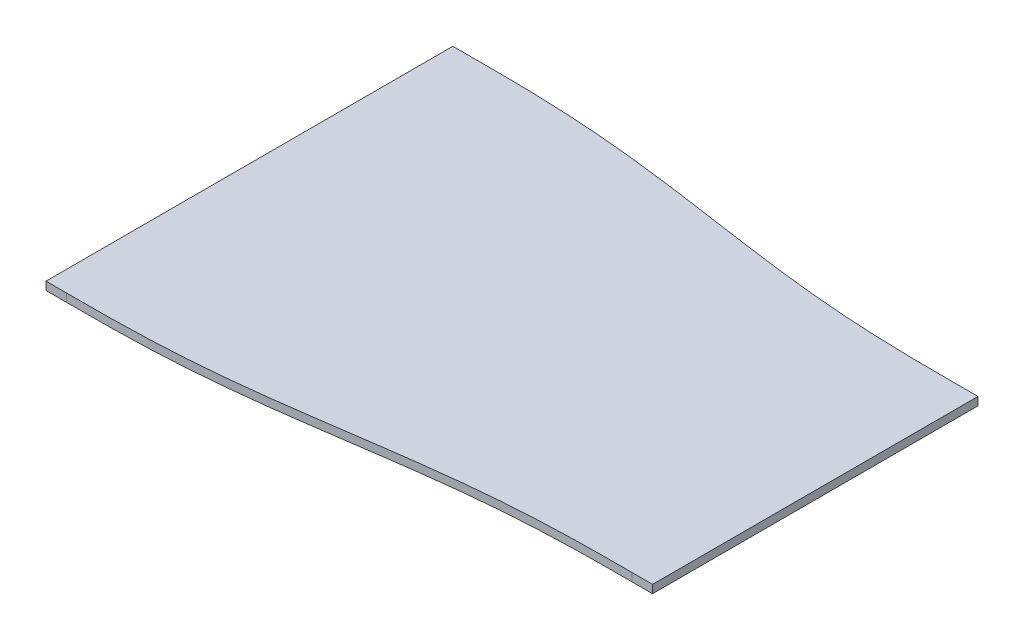
ISO-10303-21;
HEADER;
FILE_DESCRIPTION(('STEP AP214'),'2;1');
FILE_NAME('part.step','',(''),(''),'','','');
FILE_SCHEMA(('AUTOMOTIVE_DESIGN { 1 0 10303 214 1 1 1 1 }'));
ENDSEC;
DATA;
#1=APPLICATION_CONTEXT('core data for automotive mechanical design processes');
#2=APPLICATION_PROTOCOL_DEFINITION('international standard','automotive_design',2000,#1);
#3=PRODUCT_CONTEXT('',#1,'mechanical');
#4=PRODUCT('Part','Part','',(#3));
#5=PRODUCT_RELATED_PRODUCT_CATEGORY('part','',(#4));
#6=PRODUCT_DEFINITION_FORMATION('','',#4);
#7=PRODUCT_DEFINITION_CONTEXT('part definition',#1,'design');
#8=PRODUCT_DEFINITION('design','',#6,#7);
#9=PRODUCT_DEFINITION_SHAPE('','',#8);
#10=(LENGTH_UNIT() NAMED_UNIT(*) SI_UNIT(.MILLI.,.METRE.));
#11=(NAMED_UNIT(*) PLANE_ANGLE_UNIT() SI_UNIT($,.RADIAN.));
#12=(NAMED_UNIT(*) SI_UNIT($,.STERADIAN.) SOLID_ANGLE_UNIT());
#13=UNCERTAINTY_MEASURE_WITH_UNIT(LENGTH_MEASURE(1.E-05),#10,'distance_accuracy_value','');
#14=(GEOMETRIC_REPRESENTATION_CONTEXT(3) GLOBAL_UNCERTAINTY_ASSIGNED_CONTEXT((#13)) GLOBAL_UNIT_ASSIGNED_CONTEXT((#10,
#11,#12)) REPRESENTATION_CONTEXT('',''));
#15=CARTESIAN_POINT('',(0.,0.,0.));
#16=DIRECTION('',(0.,0.,1.));
#17=DIRECTION('',(1.,0.,0.));
#18=AXIS2_PLACEMENT_3D('',#15,#16,#17);
#19=CARTESIAN_POINT('',(670.050000000231,10.,199.999999999994));
#20=DIRECTION('',(-1.,0.,0.));
#21=DIRECTION('',(0.,0.,1.));
#22=AXIS2_PLACEMENT_3D('',#19,#20,#21);
#23=PLANE('',#22);
#24=DIRECTION('',(0.,0.,-1.));
#25=VECTOR('',#24,1.);
#26=CARTESIAN_POINT('',(670.050000000231,0.,199.999999999994));
#27=LINE('',#26,#25);
#28=CARTESIAN_POINT('',(670.050000000231,0.,199.999999999994));
#29=VERTEX_POINT('',#28);
#30=CARTESIAN_POINT('',(670.050000000231,0.,-199.999999999602));
#31=VERTEX_POINT('',#30);
#32=EDGE_CURVE('E192',#29,#31,#27,.T.);
#33=ORIENTED_EDGE('',*,*,#32,.T.);
#34=DIRECTION('',(0.,-1.,0.));
#35=VECTOR('',#34,1.);
#36=CARTESIAN_POINT('',(670.050000000231,10.,-199.999999999602));
#37=LINE('',#36,#35);
#38=CARTESIAN_POINT('',(670.050000000231,10.,-199.999999999602));
#39=VERTEX_POINT('',#38);
#40=EDGE_CURVE('E11',#39,#31,#37,.T.);
#41=ORIENTED_EDGE('',*,*,#40,.F.);
#42=DIRECTION('',(0.,0.,-1.));
#43=VECTOR('',#42,1.);
#44=CARTESIAN_POINT('',(670.050000000231,10.,199.999999999994));
#45=LINE('',#44,#43);
#46=CARTESIAN_POINT('',(670.050000000231,10.,199.999999999994));
#47=VERTEX_POINT('',#46);
#48=EDGE_CURVE('E209',#47,#39,#45,.T.);
#49=ORIENTED_EDGE('',*,*,#48,.F.);
#50=DIRECTION('',(0.,-1.,0.));
#51=VECTOR('',#50,1.);
#52=CARTESIAN_POINT('',(670.050000000231,10.,199.999999999994));
#53=LINE('',#52,#51);
#54=EDGE_CURVE('E125',#47,#29,#53,.T.);
#55=ORIENTED_EDGE('',*,*,#54,.T.);
#56=EDGE_LOOP('',(#33,#41,#49,#55));
#57=FACE_BOUND('',#56,.T.);
#58=ADVANCED_FACE('F33',(#57),#23,.F.);
#59=CARTESIAN_POINT('',(644.650000000231,10.,-199.999999999602));
#60=DIRECTION('',(0.,0.,1.));
#61=DIRECTION('',(1.,0.,0.));
#62=AXIS2_PLACEMENT_3D('',#59,#60,#61);
#63=PLANE('',#62);
#64=DIRECTION('',(-1.,0.,0.));
#65=VECTOR('',#64,1.);
#66=CARTESIAN_POINT('',(644.650000000231,0.,-199.999999999602));
#67=LINE('',#66,#65);
#68=CARTESIAN_POINT('',(644.650000000231,0.,-199.999999999602));
#69=VERTEX_POINT('',#68);
#70=EDGE_CURVE('E189',#31,#69,#67,.T.);
#71=ORIENTED_EDGE('',*,*,#70,.T.);
#72=DIRECTION('',(0.,-1.,0.));
#73=VECTOR('',#72,1.);
#74=CARTESIAN_POINT('',(644.650000000231,10.,-199.999999999602));
#75=LINE('',#74,#73);
#76=CARTESIAN_POINT('',(644.650000000231,10.,-199.999999999602));
#77=VERTEX_POINT('',#76);
#78=EDGE_CURVE('E41',#77,#69,#75,.T.);
#79=ORIENTED_EDGE('',*,*,#78,.F.);
#80=DIRECTION('',(-1.,0.,0.));
#81=VECTOR('',#80,1.);
#82=CARTESIAN_POINT('',(644.650000000231,10.,-199.999999999602));
#83=LINE('',#82,#81);
#84=EDGE_CURVE('E92',#39,#77,#83,.T.);
#85=ORIENTED_EDGE('',*,*,#84,.F.);
#86=ORIENTED_EDGE('',*,*,#40,.T.);
#87=EDGE_LOOP('',(#71,#79,#85,#86));
#88=FACE_BOUND('',#87,.T.);
#89=ADVANCED_FACE('F154',(#88),#63,.F.);
#90=CARTESIAN_POINT('',(644.650000000236,10.,-199.999999999603));
#91=CARTESIAN_POINT('',(642.128887323101,10.,-199.999999999604));
#92=CARTESIAN_POINT('',(638.382457018866,10.,-199.999999984757));
#93=CARTESIAN_POINT('',(629.712769059734,10.,-200.002474738857));
#94=CARTESIAN_POINT('',(624.206757774097,10.,-200.015195132757));
#95=CARTESIAN_POINT('',(616.977186652625,10.,-200.033217285951));
#96=CARTESIAN_POINT('',(611.673694071765,10.,-200.061023788659));
#97=CARTESIAN_POINT('',(605.189888029535,10.,-200.100425069511));
#98=CARTESIAN_POINT('',(599.293422889466,10.,-200.153904026494));
#99=CARTESIAN_POINT('',(592.950274347342,10.,-200.223777791852));
#100=CARTESIAN_POINT('',(585.077126140812,10.,-200.334920276666));
#101=CARTESIAN_POINT('',(575.615150605977,10.,-200.506371684541));
#102=CARTESIAN_POINT('',(564.778145102134,10.,-200.764489072655));
#103=CARTESIAN_POINT('',(549.478620254523,10.,-201.239741284618));
#104=CARTESIAN_POINT('',(531.359153773348,10.,-201.987923337076));
#105=CARTESIAN_POINT('',(510.224122789078,10.,-203.148964487618));
#106=CARTESIAN_POINT('',(489.117075125837,10.,-204.664961439601));
#107=CARTESIAN_POINT('',(471.042219016799,10.,-206.211322516499));
#108=CARTESIAN_POINT('',(452.986247287745,10.,-207.94458891218));
#109=CARTESIAN_POINT('',(433.001107321674,10.,-210.061958697482));
#110=CARTESIAN_POINT('',(410.042516088179,10.,-212.789005998156));
#111=CARTESIAN_POINT('',(384.120515653695,10.,-216.183750570737));
#112=CARTESIAN_POINT('',(358.228844737021,10.,-219.797816742544));
#113=CARTESIAN_POINT('',(334.291027151638,10.,-223.253392129152));
#114=CARTESIAN_POINT('',(310.358989888133,10.,-226.746607493557));
#115=CARTESIAN_POINT('',(286.421101663587,10.,-230.202184450567));
#116=CARTESIAN_POINT('',(260.529589306638,10.,-233.816247037121));
#117=CARTESIAN_POINT('',(234.607319328917,10.,-237.210998028756));
#118=CARTESIAN_POINT('',(208.646910268751,10.,-240.294638585617));
#119=CARTESIAN_POINT('',(182.641737439012,10.,-242.990791615495));
#120=CARTESIAN_POINT('',(158.550277549518,10.,-245.118473578478));
#121=CARTESIAN_POINT('',(134.422777808158,10.,-246.851031881093));
#122=CARTESIAN_POINT('',(110.27707794291,10.,-248.177942168241));
#123=CARTESIAN_POINT('',(88.9383800885653,10.,-249.000224322157));
#124=CARTESIAN_POINT('',(72.0553878654647,10.,-249.438693030905));
#125=CARTESIAN_POINT('',(59.5777987769528,10.,-249.665078924938));
#126=CARTESIAN_POINT('',(51.6977397383509,10.,-249.776222765111));
#127=CARTESIAN_POINT('',(45.353978297629,10.,-249.846095556507));
#128=CARTESIAN_POINT('',(39.4690194837837,10.,-249.899575195096));
#129=CARTESIAN_POINT('',(32.9584093593179,10.,-249.938976051475));
#130=CARTESIAN_POINT('',(27.7035624300112,10.,-249.966782803266));
#131=CARTESIAN_POINT('',(20.3962778483213,10.,-249.984804823661));
#132=CARTESIAN_POINT('',(15.0165072907433,10.,-249.997525286364));
#133=CARTESIAN_POINT('',(6.20960090593619,10.,-250.000000012963));
#134=CARTESIAN_POINT('',(2.52111267707503,10.,-249.999999999998));
#135=CARTESIAN_POINT('',(-1.4576344786805E-10,10.,-250.));
#136=B_SPLINE_CURVE_WITH_KNOTS('',4,(#90,#91,#92,#93,#94,#95,#96,#97,#98,#99,#100,#101,#102,
#103,#104,#105,#106,#107,#108,#109,#110,#111,#112,#113,#114,#115,#116,#117,#118,#119,#120,#121,
#122,#123,#124,#125,#126,#127,#128,#129,#130,#131,#132,#133,#134,#135),.UNSPECIFIED.,.F.,.F.,(5,
1,1,1,1,1,1,1,1,1,1,1,1,1,1,1,1,1,1,1,1,1,1,1,1,1,1,1,1,1,1,1,1,1,1,1,1,1,1,1,1,1,5),
(0.0830423094644617,0.0986189314826091,0.106407242491683,0.114195553500756,0.12198386450983,
0.129772175518904,0.137560486527977,0.145348797537051,0.153607863121786,0.16186692870652,
0.17838505987599,0.193961681412317,0.209538302948644,0.240691545530784,0.271844787408312,
0.302998032082512,0.318574655477985,0.334151278873459,0.365304526363944,0.406540267070604,
0.437693511258934,0.468846755447264,0.499999999999994,0.531153244552725,0.562306488741055,
0.593459732929385,0.634695473636054,0.665848721126538,0.697001967917485,0.728155212591684,
0.759308454469212,0.790461697051351,0.821614940124003,0.838133071293466,0.846392136878198,
0.854651202462929,0.862439513472005,0.870227824481081,0.878016135490157,0.885804446499232,
0.893592757508308,0.901381068517384,0.916957690535536),.UNSPECIFIED.);
#137=DIRECTION('',(0.,-1.,0.));
#138=VECTOR('',#137,1.);
#139=SURFACE_OF_LINEAR_EXTRUSION('',#136,#138);
#140=CARTESIAN_POINT('',(644.650000000236,0.,-199.999999999603));
#141=CARTESIAN_POINT('',(642.128887323101,0.,-199.999999999604));
#142=CARTESIAN_POINT('',(638.382457018866,0.,-199.999999984757));
#143=CARTESIAN_POINT('',(629.712769059734,0.,-200.002474738857));
#144=CARTESIAN_POINT('',(624.206757774097,0.,-200.015195132757));
#145=CARTESIAN_POINT('',(616.977186652625,0.,-200.033217285951));
#146=CARTESIAN_POINT('',(611.673694071765,0.,-200.061023788659));
#147=CARTESIAN_POINT('',(605.189888029535,0.,-200.100425069511));
#148=CARTESIAN_POINT('',(599.293422889466,0.,-200.153904026494));
#149=CARTESIAN_POINT('',(592.950274347342,0.,-200.223777791852));
#150=CARTESIAN_POINT('',(585.077126140812,0.,-200.334920276666));
#151=CARTESIAN_POINT('',(575.615150605977,0.,-200.506371684541));
#152=CARTESIAN_POINT('',(564.778145102134,0.,-200.764489072655));
#153=CARTESIAN_POINT('',(549.478620254523,0.,-201.239741284618));
#154=CARTESIAN_POINT('',(531.359153773348,0.,-201.987923337076));
#155=CARTESIAN_POINT('',(510.224122789078,0.,-203.148964487618));
#156=CARTESIAN_POINT('',(489.117075125837,0.,-204.664961439601));
#157=CARTESIAN_POINT('',(471.042219016799,0.,-206.211322516499));
#158=CARTESIAN_POINT('',(452.986247287745,0.,-207.94458891218));
#159=CARTESIAN_POINT('',(433.001107321674,0.,-210.061958697482));
#160=CARTESIAN_POINT('',(410.042516088179,0.,-212.789005998156));
#161=CARTESIAN_POINT('',(384.120515653695,0.,-216.183750570737));
#162=CARTESIAN_POINT('',(358.228844737021,0.,-219.797816742544));
#163=CARTESIAN_POINT('',(334.291027151638,0.,-223.253392129152));
#164=CARTESIAN_POINT('',(310.358989888133,0.,-226.746607493557));
#165=CARTESIAN_POINT('',(286.421101663587,0.,-230.202184450567));
#166=CARTESIAN_POINT('',(260.529589306638,0.,-233.816247037121));
#167=CARTESIAN_POINT('',(234.607319328917,0.,-237.210998028756));
#168=CARTESIAN_POINT('',(208.646910268751,0.,-240.294638585617));
#169=CARTESIAN_POINT('',(182.641737439012,0.,-242.990791615495));
#170=CARTESIAN_POINT('',(158.550277549518,0.,-245.118473578478));
#171=CARTESIAN_POINT('',(134.422777808158,0.,-246.851031881093));
#172=CARTESIAN_POINT('',(110.27707794291,0.,-248.177942168241));
#173=CARTESIAN_POINT('',(88.9383800885653,0.,-249.000224322157));
#174=CARTESIAN_POINT('',(72.0553878654647,0.,-249.438693030905));
#175=CARTESIAN_POINT('',(59.5777987769528,0.,-249.665078924938));
#176=CARTESIAN_POINT('',(51.6977397383509,0.,-249.776222765111));
#177=CARTESIAN_POINT('',(45.353978297629,0.,-249.846095556507));
#178=CARTESIAN_POINT('',(39.4690194837837,0.,-249.899575195096));
#179=CARTESIAN_POINT('',(32.9584093593179,0.,-249.938976051475));
#180=CARTESIAN_POINT('',(27.7035624300112,0.,-249.966782803266));
#181=CARTESIAN_POINT('',(20.3962778483213,0.,-249.984804823661));
#182=CARTESIAN_POINT('',(15.0165072907433,0.,-249.997525286364));
#183=CARTESIAN_POINT('',(6.20960090593619,0.,-250.000000012963));
#184=CARTESIAN_POINT('',(2.52111267707503,0.,-249.999999999998));
#185=CARTESIAN_POINT('',(-1.4576344786805E-10,0.,-250.));
#186=B_SPLINE_CURVE_WITH_KNOTS('',4,(#140,#141,#142,#143,#144,#145,#146,#147,#148,#149,#150,
#151,#152,#153,#154,#155,#156,#157,#158,#159,#160,#161,#162,#163,#164,#165,#166,#167,#168,#169,
#170,#171,#172,#173,#174,#175,#176,#177,#178,#179,#180,#181,#182,#183,#184,#185),.UNSPECIFIED.,
.F.,.F.,(5,1,1,1,1,1,1,1,1,1,1,1,1,1,1,1,1,1,1,1,1,1,1,1,1,1,1,1,1,1,1,1,1,1,1,1,1,1,1,1,1,1,5),
(0.0830423094644617,0.0986189314826091,0.106407242491683,0.114195553500756,0.12198386450983,
0.129772175518904,0.137560486527977,0.145348797537051,0.153607863121786,0.16186692870652,
0.17838505987599,0.193961681412317,0.209538302948644,0.240691545530784,0.271844787408312,
0.302998032082512,0.318574655477985,0.334151278873459,0.365304526363944,0.406540267070604,
0.437693511258934,0.468846755447264,0.499999999999994,0.531153244552725,0.562306488741055,
0.593459732929385,0.634695473636054,0.665848721126538,0.697001967917485,0.728155212591684,
0.759308454469212,0.790461697051351,0.821614940124003,0.838133071293466,0.846392136878198,
0.854651202462929,0.862439513472005,0.870227824481081,0.878016135490157,0.885804446499232,
0.893592757508308,0.901381068517384,0.916957690535536),.UNSPECIFIED.);
#187=CARTESIAN_POINT('',(-1.4576344786805E-10,0.,-250.));
#188=VERTEX_POINT('',#187);
#189=EDGE_CURVE('E185',#69,#188,#186,.T.);
#190=ORIENTED_EDGE('',*,*,#189,.T.);
#191=DIRECTION('',(0.,-1.,0.));
#192=VECTOR('',#191,1.);
#193=CARTESIAN_POINT('',(-1.4576344786805E-10,10.,-250.));
#194=LINE('',#193,#192);
#195=CARTESIAN_POINT('',(-1.4576344786805E-10,10.,-250.));
#196=VERTEX_POINT('',#195);
#197=EDGE_CURVE('E177',#196,#188,#194,.T.);
#198=ORIENTED_EDGE('',*,*,#197,.F.);
#199=EDGE_CURVE('E156',#77,#196,#136,.T.);
#200=ORIENTED_EDGE('',*,*,#199,.F.);
#201=ORIENTED_EDGE('',*,*,#78,.T.);
#202=EDGE_LOOP('',(#190,#198,#200,#201));
#203=FACE_BOUND('',#202,.T.);
#204=ADVANCED_FACE('F150',(#203),#139,.F.);
#205=CARTESIAN_POINT('',(-1.21469783016803E-10,10.,-250.));
#206=DIRECTION('',(0.,0.,1.));
#207=DIRECTION('',(1.,0.,0.));
#208=AXIS2_PLACEMENT_3D('',#205,#206,#207);
#209=PLANE('',#208);
#210=DIRECTION('',(-1.,0.,0.));
#211=VECTOR('',#210,1.);
#212=CARTESIAN_POINT('',(-1.21469783016803E-10,0.,-250.));
#213=LINE('',#212,#211);
#214=CARTESIAN_POINT('',(-25.4000000001215,0.,-250.));
#215=VERTEX_POINT('',#214);
#216=EDGE_CURVE('E175',#188,#215,#213,.T.);
#217=ORIENTED_EDGE('',*,*,#216,.T.);
#218=DIRECTION('',(0.,-1.,0.));
#219=VECTOR('',#218,1.);
#220=CARTESIAN_POINT('',(-25.4000000001215,10.,-250.));
#221=LINE('',#220,#219);
#222=CARTESIAN_POINT('',(-25.4000000001215,10.,-250.));
#223=VERTEX_POINT('',#222);
#224=EDGE_CURVE('E173',#223,#215,#221,.T.);
#225=ORIENTED_EDGE('',*,*,#224,.F.);
#226=DIRECTION('',(-1.,0.,0.));
#227=VECTOR('',#226,1.);
#228=CARTESIAN_POINT('',(-1.21469783016803E-10,10.,-250.));
#229=LINE('',#228,#227);
#230=EDGE_CURVE('E162',#196,#223,#229,.T.);
#231=ORIENTED_EDGE('',*,*,#230,.F.);
#232=ORIENTED_EDGE('',*,*,#197,.T.);
#233=EDGE_LOOP('',(#217,#225,#231,#232));
#234=FACE_BOUND('',#233,.T.);
#235=ADVANCED_FACE('F146',(#234),#209,.F.);
#236=CARTESIAN_POINT('',(-25.4000000001215,10.,250.));
#237=DIRECTION('',(1.,0.,0.));
#238=DIRECTION('',(0.,0.,-1.));
#239=AXIS2_PLACEMENT_3D('',#236,#237,#238);
#240=PLANE('',#239);
#241=DIRECTION('',(0.,0.,1.));
#242=VECTOR('',#241,1.);
#243=CARTESIAN_POINT('',(-25.4000000001215,0.,250.));
#244=LINE('',#243,#242);
#245=CARTESIAN_POINT('',(-25.4000000001215,0.,250.));
#246=VERTEX_POINT('',#245);
#247=EDGE_CURVE('E179',#215,#246,#244,.T.);
#248=ORIENTED_EDGE('',*,*,#247,.T.);
#249=DIRECTION('',(0.,-1.,0.));
#250=VECTOR('',#249,1.);
#251=CARTESIAN_POINT('',(-25.4000000001215,10.,250.));
#252=LINE('',#251,#250);
#253=CARTESIAN_POINT('',(-25.4000000001215,10.,250.));
#254=VERTEX_POINT('',#253);
#255=EDGE_CURVE('E120',#254,#246,#252,.T.);
#256=ORIENTED_EDGE('',*,*,#255,.F.);
#257=DIRECTION('',(0.,0.,1.));
#258=VECTOR('',#257,1.);
#259=CARTESIAN_POINT('',(-25.4000000001215,10.,250.));
#260=LINE('',#259,#258);
#261=EDGE_CURVE('E111',#223,#254,#260,.T.);
#262=ORIENTED_EDGE('',*,*,#261,.F.);
#263=ORIENTED_EDGE('',*,*,#224,.T.);
#264=EDGE_LOOP('',(#248,#256,#262,#263));
#265=FACE_BOUND('',#264,.T.);
#266=ADVANCED_FACE('F143',(#265),#240,.F.);
#267=CARTESIAN_POINT('',(-1.21471626160496E-10,10.,250.));
#268=DIRECTION('',(0.,0.,-1.));
#269=DIRECTION('',(-1.,0.,0.));
#270=AXIS2_PLACEMENT_3D('',#267,#268,#269);
#271=PLANE('',#270);
#272=DIRECTION('',(1.,0.,0.));
#273=VECTOR('',#272,1.);
#274=CARTESIAN_POINT('',(-1.21471626160496E-10,0.,250.));
#275=LINE('',#274,#273);
#276=CARTESIAN_POINT('',(-1.21471626160496E-10,0.,250.));
#277=VERTEX_POINT('',#276);
#278=EDGE_CURVE('E119',#246,#277,#275,.T.);
#279=ORIENTED_EDGE('',*,*,#278,.T.);
#280=DIRECTION('',(0.,-1.,0.));
#281=VECTOR('',#280,1.);
#282=CARTESIAN_POINT('',(-1.21471626160496E-10,10.,250.));
#283=LINE('',#282,#281);
#284=CARTESIAN_POINT('',(-1.21471626160496E-10,10.,250.));
#285=VERTEX_POINT('',#284);
#286=EDGE_CURVE('E116',#285,#277,#283,.T.);
#287=ORIENTED_EDGE('',*,*,#286,.F.);
#288=DIRECTION('',(1.,0.,0.));
#289=VECTOR('',#288,1.);
#290=CARTESIAN_POINT('',(-1.21471626160496E-10,10.,250.));
#291=LINE('',#290,#289);
#292=EDGE_CURVE('E105',#254,#285,#291,.T.);
#293=ORIENTED_EDGE('',*,*,#292,.F.);
#294=ORIENTED_EDGE('',*,*,#255,.T.);
#295=EDGE_LOOP('',(#279,#287,#293,#294));
#296=FACE_BOUND('',#295,.T.);
#297=ADVANCED_FACE('F117',(#296),#271,.F.);
#298=CARTESIAN_POINT('',(-1.45765545288206E-10,10.,250.));
#299=CARTESIAN_POINT('',(2.52111267706858,10.,250.));
#300=CARTESIAN_POINT('',(6.20960090593315,10.,250.000000012966));
#301=CARTESIAN_POINT('',(15.0165072907244,10.,249.997525286373));
#302=CARTESIAN_POINT('',(20.3962778482974,10.,249.984804823673));
#303=CARTESIAN_POINT('',(27.7035624299872,10.,249.966782803283));
#304=CARTESIAN_POINT('',(32.9584093592939,10.,249.938976051495));
#305=CARTESIAN_POINT('',(39.4690194837598,10.,249.89957519512));
#306=CARTESIAN_POINT('',(45.3539782976051,10.,249.846095556534));
#307=CARTESIAN_POINT('',(51.697739738327,10.,249.776222765143));
#308=CARTESIAN_POINT('',(59.577798776929,10.,249.665078924975));
#309=CARTESIAN_POINT('',(72.0553878654411,10.,249.438693030949));
#310=CARTESIAN_POINT('',(88.9383800885419,10.,249.000224322211));
#311=CARTESIAN_POINT('',(110.277077942887,10.,248.177942168308));
#312=CARTESIAN_POINT('',(134.422777808136,10.,246.851031881175));
#313=CARTESIAN_POINT('',(158.550277549497,10.,245.118473578575));
#314=CARTESIAN_POINT('',(182.641737438992,10.,242.990791615606));
#315=CARTESIAN_POINT('',(208.646910268733,10.,240.294638585744));
#316=CARTESIAN_POINT('',(234.607319328901,10.,237.210998028898));
#317=CARTESIAN_POINT('',(260.529589306624,10.,233.816247037279));
#318=CARTESIAN_POINT('',(286.421101663575,10.,230.202184450741));
#319=CARTESIAN_POINT('',(310.358989888123,10.,226.746607493746));
#320=CARTESIAN_POINT('',(334.29102715163,10.,223.253392129355));
#321=CARTESIAN_POINT('',(358.228844737015,10.,219.797816742761));
#322=CARTESIAN_POINT('',(384.120515653691,10.,216.183750570971));
#323=CARTESIAN_POINT('',(410.042516088177,10.,212.789005998405));
#324=CARTESIAN_POINT('',(433.001107321674,10.,210.061958697745));
#325=CARTESIAN_POINT('',(452.986247287747,10.,207.944588912455));
#326=CARTESIAN_POINT('',(471.042219016802,10.,206.211322516785));
#327=CARTESIAN_POINT('',(489.117075125841,10.,204.664961439898));
#328=CARTESIAN_POINT('',(510.224122789083,10.,203.148964487928));
#329=CARTESIAN_POINT('',(531.359153773354,10.,201.987923337399));
#330=CARTESIAN_POINT('',(549.478620254528,10.,201.239741284952));
#331=CARTESIAN_POINT('',(564.77814510214,10.,200.764489072998));
#332=CARTESIAN_POINT('',(575.615150605983,10.,200.50637168489));
#333=CARTESIAN_POINT('',(585.077126140818,10.,200.334920277021));
#334=CARTESIAN_POINT('',(592.950274347348,10.,200.223777792212));
#335=CARTESIAN_POINT('',(599.293422889472,10.,200.153904026858));
#336=CARTESIAN_POINT('',(605.189888029541,10.,200.100425069878));
#337=CARTESIAN_POINT('',(611.673694071772,10.,200.061023789031));
#338=CARTESIAN_POINT('',(616.977186652631,10.,200.033217286325));
#339=CARTESIAN_POINT('',(624.206757774103,10.,200.015195133136));
#340=CARTESIAN_POINT('',(629.712769059739,10.,200.00247473924));
#341=CARTESIAN_POINT('',(638.382457018867,10.,199.999999985145));
#342=CARTESIAN_POINT('',(642.128887323102,10.,199.999999999994));
#343=CARTESIAN_POINT('',(644.650000000236,10.,199.999999999994));
#344=B_SPLINE_CURVE_WITH_KNOTS('',4,(#298,#299,#300,#301,#302,#303,#304,#305,#306,#307,#308,
#309,#310,#311,#312,#313,#314,#315,#316,#317,#318,#319,#320,#321,#322,#323,#324,#325,#326,#327,
#328,#329,#330,#331,#332,#333,#334,#335,#336,#337,#338,#339,#340,#341,#342,#343),.UNSPECIFIED.,
.F.,.F.,(5,1,1,1,1,1,1,1,1,1,1,1,1,1,1,1,1,1,1,1,1,1,1,1,1,1,1,1,1,1,1,1,1,1,1,1,1,1,1,1,1,1,5),
(0.0830423094644617,0.0986189314826134,0.106407242491689,0.114195553500765,0.121983864509841,
0.129772175518917,0.137560486527993,0.145348797537068,0.1536078631218,0.161866928706532,
0.178385059875995,0.209538302948646,0.240691545530785,0.271844787408313,0.302998032082513,
0.33415127887346,0.365304526363944,0.406540267070612,0.437693511258943,0.468846755447273,
0.500000000000003,0.531153244552733,0.562306488741064,0.593459732929394,0.634695473636054,
0.665848721126538,0.681425344522012,0.697001967917486,0.728155212591686,0.759308454469214,
0.790461697051354,0.806038318587681,0.821614940124008,0.838133071293477,0.846392136878212,
0.854651202462946,0.86243951347202,0.870227824481094,0.878016135490167,0.885804446499241,
0.893592757508315,0.901381068517388,0.916957690535536),.UNSPECIFIED.);
#345=DIRECTION('',(0.,-1.,0.));
#346=VECTOR('',#345,1.);
#347=SURFACE_OF_LINEAR_EXTRUSION('',#344,#346);
#348=CARTESIAN_POINT('',(-1.45765545288206E-10,0.,250.));
#349=CARTESIAN_POINT('',(2.52111267706858,0.,250.));
#350=CARTESIAN_POINT('',(6.20960090593315,0.,250.000000012966));
#351=CARTESIAN_POINT('',(15.0165072907244,0.,249.997525286373));
#352=CARTESIAN_POINT('',(20.3962778482974,0.,249.984804823673));
#353=CARTESIAN_POINT('',(27.7035624299872,0.,249.966782803283));
#354=CARTESIAN_POINT('',(32.9584093592939,0.,249.938976051495));
#355=CARTESIAN_POINT('',(39.4690194837598,0.,249.89957519512));
#356=CARTESIAN_POINT('',(45.3539782976051,0.,249.846095556534));
#357=CARTESIAN_POINT('',(51.697739738327,0.,249.776222765143));
#358=CARTESIAN_POINT('',(59.577798776929,0.,249.665078924975));
#359=CARTESIAN_POINT('',(72.0553878654411,0.,249.438693030949));
#360=CARTESIAN_POINT('',(88.9383800885419,0.,249.000224322211));
#361=CARTESIAN_POINT('',(110.277077942887,0.,248.177942168308));
#362=CARTESIAN_POINT('',(134.422777808136,0.,246.851031881175));
#363=CARTESIAN_POINT('',(158.550277549497,0.,245.118473578575));
#364=CARTESIAN_POINT('',(182.641737438992,0.,242.990791615606));
#365=CARTESIAN_POINT('',(208.646910268733,0.,240.294638585744));
#366=CARTESIAN_POINT('',(234.607319328901,0.,237.210998028898));
#367=CARTESIAN_POINT('',(260.529589306624,0.,233.816247037279));
#368=CARTESIAN_POINT('',(286.421101663575,0.,230.202184450741));
#369=CARTESIAN_POINT('',(310.358989888123,0.,226.746607493746));
#370=CARTESIAN_POINT('',(334.29102715163,0.,223.253392129355));
#371=CARTESIAN_POINT('',(358.228844737015,0.,219.797816742761));
#372=CARTESIAN_POINT('',(384.120515653691,0.,216.183750570971));
#373=CARTESIAN_POINT('',(410.042516088177,0.,212.789005998405));
#374=CARTESIAN_POINT('',(433.001107321674,0.,210.061958697745));
#375=CARTESIAN_POINT('',(452.986247287747,0.,207.944588912455));
#376=CARTESIAN_POINT('',(471.042219016802,0.,206.211322516785));
#377=CARTESIAN_POINT('',(489.117075125841,0.,204.664961439898));
#378=CARTESIAN_POINT('',(510.224122789083,0.,203.148964487928));
#379=CARTESIAN_POINT('',(531.359153773354,0.,201.987923337399));
#380=CARTESIAN_POINT('',(549.478620254528,0.,201.239741284952));
#381=CARTESIAN_POINT('',(564.77814510214,0.,200.764489072998));
#382=CARTESIAN_POINT('',(575.615150605983,0.,200.50637168489));
#383=CARTESIAN_POINT('',(585.077126140818,0.,200.334920277021));
#384=CARTESIAN_POINT('',(592.950274347348,0.,200.223777792212));
#385=CARTESIAN_POINT('',(599.293422889472,0.,200.153904026858));
#386=CARTESIAN_POINT('',(605.189888029541,0.,200.100425069878));
#387=CARTESIAN_POINT('',(611.673694071772,0.,200.061023789031));
#388=CARTESIAN_POINT('',(616.977186652631,0.,200.033217286325));
#389=CARTESIAN_POINT('',(624.206757774103,0.,200.015195133136));
#390=CARTESIAN_POINT('',(629.712769059739,0.,200.00247473924));
#391=CARTESIAN_POINT('',(638.382457018867,0.,199.999999985145));
#392=CARTESIAN_POINT('',(642.128887323102,0.,199.999999999994));
#393=CARTESIAN_POINT('',(644.650000000236,0.,199.999999999994));
#394=B_SPLINE_CURVE_WITH_KNOTS('',4,(#348,#349,#350,#351,#352,#353,#354,#355,#356,#357,#358,
#359,#360,#361,#362,#363,#364,#365,#366,#367,#368,#369,#370,#371,#372,#373,#374,#375,#376,#377,
#378,#379,#380,#381,#382,#383,#384,#385,#386,#387,#388,#389,#390,#391,#392,#393),.UNSPECIFIED.,
.F.,.F.,(5,1,1,1,1,1,1,1,1,1,1,1,1,1,1,1,1,1,1,1,1,1,1,1,1,1,1,1,1,1,1,1,1,1,1,1,1,1,1,1,1,1,5),
(0.0830423094644617,0.0986189314826134,0.106407242491689,0.114195553500765,0.121983864509841,
0.129772175518917,0.137560486527993,0.145348797537068,0.1536078631218,0.161866928706532,
0.178385059875995,0.209538302948646,0.240691545530785,0.271844787408313,0.302998032082513,
0.33415127887346,0.365304526363944,0.406540267070612,0.437693511258943,0.468846755447273,
0.500000000000003,0.531153244552733,0.562306488741064,0.593459732929394,0.634695473636054,
0.665848721126538,0.681425344522012,0.697001967917486,0.728155212591686,0.759308454469214,
0.790461697051354,0.806038318587681,0.821614940124008,0.838133071293477,0.846392136878212,
0.854651202462946,0.86243951347202,0.870227824481094,0.878016135490167,0.885804446499241,
0.893592757508315,0.901381068517388,0.916957690535536),.UNSPECIFIED.);
#395=CARTESIAN_POINT('',(644.650000000236,0.,199.999999999994));
#396=VERTEX_POINT('',#395);
#397=EDGE_CURVE('E78',#277,#396,#394,.T.);
#398=ORIENTED_EDGE('',*,*,#397,.T.);
#399=DIRECTION('',(0.,-1.,0.));
#400=VECTOR('',#399,1.);
#401=CARTESIAN_POINT('',(644.650000000236,10.,199.999999999994));
#402=LINE('',#401,#400);
#403=CARTESIAN_POINT('',(644.650000000236,10.,199.999999999994));
#404=VERTEX_POINT('',#403);
#405=EDGE_CURVE('E121',#404,#396,#402,.T.);
#406=ORIENTED_EDGE('',*,*,#405,.F.);
#407=EDGE_CURVE('E109',#285,#404,#344,.T.);
#408=ORIENTED_EDGE('',*,*,#407,.F.);
#409=ORIENTED_EDGE('',*,*,#286,.T.);
#410=EDGE_LOOP('',(#398,#406,#408,#409));
#411=FACE_BOUND('',#410,.T.);
#412=ADVANCED_FACE('F123',(#411),#347,.F.);
#413=CARTESIAN_POINT('',(644.650000000231,10.,199.999999999994));
#414=DIRECTION('',(0.,0.,-1.));
#415=DIRECTION('',(-1.,0.,0.));
#416=AXIS2_PLACEMENT_3D('',#413,#414,#415);
#417=PLANE('',#416);
#418=DIRECTION('',(1.,0.,0.));
#419=VECTOR('',#418,1.);
#420=CARTESIAN_POINT('',(644.650000000231,0.,199.999999999994));
#421=LINE('',#420,#419);
#422=EDGE_CURVE('E84',#396,#29,#421,.T.);
#423=ORIENTED_EDGE('',*,*,#422,.T.);
#424=ORIENTED_EDGE('',*,*,#54,.F.);
#425=DIRECTION('',(1.,0.,0.));
#426=VECTOR('',#425,1.);
#427=CARTESIAN_POINT('',(644.650000000231,10.,199.999999999994));
#428=LINE('',#427,#426);
#429=EDGE_CURVE('E49',#404,#47,#428,.T.);
#430=ORIENTED_EDGE('',*,*,#429,.F.);
#431=ORIENTED_EDGE('',*,*,#405,.T.);
#432=EDGE_LOOP('',(#423,#424,#430,#431));
#433=FACE_BOUND('',#432,.T.);
#434=ADVANCED_FACE('F139',(#433),#417,.F.);
#435=CARTESIAN_POINT('',(322.325005576583,10.,-224.999999876788));
#436=DIRECTION('',(0.,1.,0.));
#437=DIRECTION('',(0.,0.,1.));
#438=AXIS2_PLACEMENT_3D('',#435,#436,#437);
#439=PLANE('',#438);
#440=ORIENTED_EDGE('',*,*,#48,.T.);
#441=ORIENTED_EDGE('',*,*,#84,.T.);
#442=ORIENTED_EDGE('',*,*,#199,.T.);
#443=ORIENTED_EDGE('',*,*,#230,.T.);
#444=ORIENTED_EDGE('',*,*,#261,.T.);
#445=ORIENTED_EDGE('',*,*,#292,.T.);
#446=ORIENTED_EDGE('',*,*,#407,.T.);
#447=ORIENTED_EDGE('',*,*,#429,.T.);
#448=EDGE_LOOP('',(#440,#441,#442,#443,#444,#445,#446,#447));
#449=FACE_BOUND('',#448,.T.);
#450=ADVANCED_FACE('F107',(#449),#439,.T.);
#451=CARTESIAN_POINT('',(322.325005576583,0.,-224.999999876788));
#452=DIRECTION('',(0.,1.,0.));
#453=DIRECTION('',(0.,0.,1.));
#454=AXIS2_PLACEMENT_3D('',#451,#452,#453);
#455=PLANE('',#454);
#456=ORIENTED_EDGE('',*,*,#32,.F.);
#457=ORIENTED_EDGE('',*,*,#422,.F.);
#458=ORIENTED_EDGE('',*,*,#397,.F.);
#459=ORIENTED_EDGE('',*,*,#278,.F.);
#460=ORIENTED_EDGE('',*,*,#247,.F.);
#461=ORIENTED_EDGE('',*,*,#216,.F.);
#462=ORIENTED_EDGE('',*,*,#189,.F.);
#463=ORIENTED_EDGE('',*,*,#70,.F.);
#464=EDGE_LOOP('',(#456,#457,#458,#459,#460,#461,#462,#463));
#465=FACE_BOUND('',#464,.T.);
#466=ADVANCED_FACE('F188',(#465),#455,.F.);
#467=CLOSED_SHELL('',(#58,#89,#204,#235,#266,#297,#412,#434,#450,#466));
#468=MANIFOLD_SOLID_BREP('B2',#467);
#469=ADVANCED_BREP_SHAPE_REPRESENTATION('',(#18,#468),#14);
#470=SHAPE_DEFINITION_REPRESENTATION(#9,#469);
ENDSEC;
END-ISO-10303-21;
